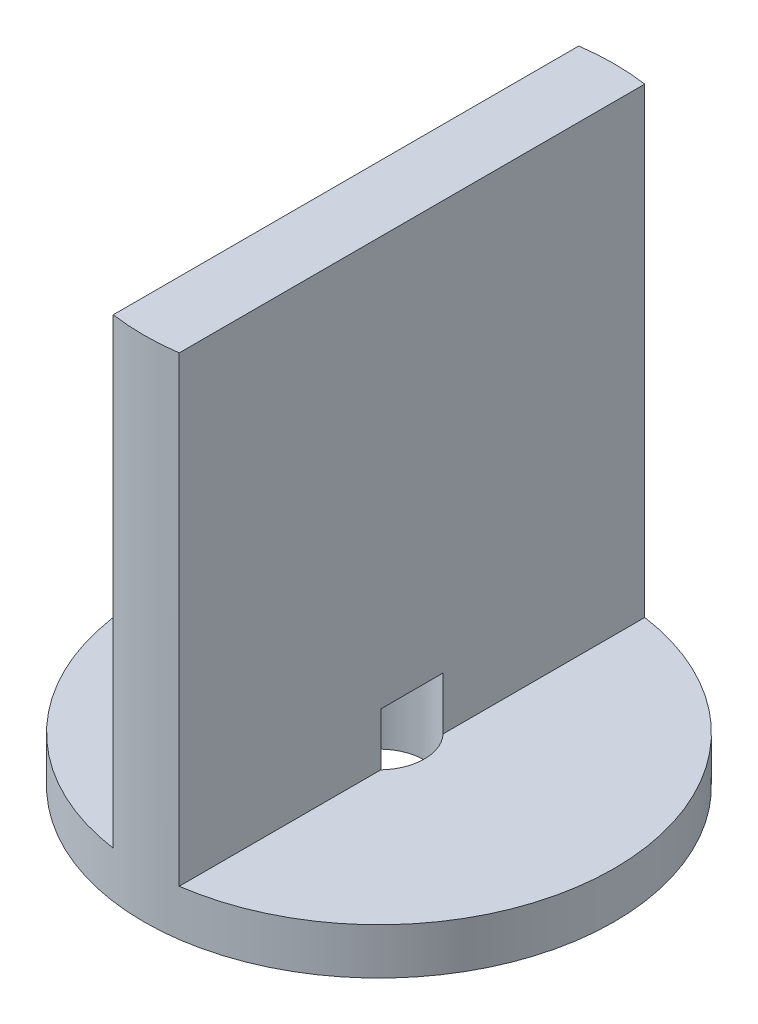
ISO-10303-21;
HEADER;
FILE_DESCRIPTION(('STEP AP214'),'2;1');
FILE_NAME('part.step','',(''),(''),'','','');
FILE_SCHEMA(('AUTOMOTIVE_DESIGN { 1 0 10303 214 1 1 1 1 }'));
ENDSEC;
DATA;
#1=APPLICATION_CONTEXT('core data for automotive mechanical design processes');
#2=APPLICATION_PROTOCOL_DEFINITION('international standard','automotive_design',2000,#1);
#3=PRODUCT_CONTEXT('',#1,'mechanical');
#4=PRODUCT('Part','Part','',(#3));
#5=PRODUCT_RELATED_PRODUCT_CATEGORY('part','',(#4));
#6=PRODUCT_DEFINITION_FORMATION('','',#4);
#7=PRODUCT_DEFINITION_CONTEXT('part definition',#1,'design');
#8=PRODUCT_DEFINITION('design','',#6,#7);
#9=PRODUCT_DEFINITION_SHAPE('','',#8);
#10=(LENGTH_UNIT() NAMED_UNIT(*) SI_UNIT(.MILLI.,.METRE.));
#11=(NAMED_UNIT(*) PLANE_ANGLE_UNIT() SI_UNIT($,.RADIAN.));
#12=(NAMED_UNIT(*) SI_UNIT($,.STERADIAN.) SOLID_ANGLE_UNIT());
#13=UNCERTAINTY_MEASURE_WITH_UNIT(LENGTH_MEASURE(1.E-05),#10,'distance_accuracy_value','');
#14=(GEOMETRIC_REPRESENTATION_CONTEXT(3) GLOBAL_UNCERTAINTY_ASSIGNED_CONTEXT((#13)) GLOBAL_UNIT_ASSIGNED_CONTEXT((#10,
#11,#12)) REPRESENTATION_CONTEXT('',''));
#15=CARTESIAN_POINT('',(0.,0.,0.));
#16=DIRECTION('',(0.,0.,1.));
#17=DIRECTION('',(1.,0.,0.));
#18=AXIS2_PLACEMENT_3D('',#15,#16,#17);
#19=CARTESIAN_POINT('',(0.,7.112,0.));
#20=DIRECTION('',(0.,1.,0.));
#21=DIRECTION('',(0.,0.,1.));
#22=AXIS2_PLACEMENT_3D('',#19,#20,#21);
#23=PLANE('',#22);
#24=CARTESIAN_POINT('',(0.,7.112,0.));
#25=DIRECTION('',(0.,1.,0.));
#26=DIRECTION('',(0.,0.,1.));
#27=AXIS2_PLACEMENT_3D('',#24,#25,#26);
#28=CIRCLE('',#27,36.195);
#29=CARTESIAN_POINT('',(-5.08,7.112,-35.8367356911871));
#30=VERTEX_POINT('',#29);
#31=CARTESIAN_POINT('',(-5.08,7.112,35.8367356911871));
#32=VERTEX_POINT('',#31);
#33=EDGE_CURVE('E67',#30,#32,#28,.T.);
#34=ORIENTED_EDGE('',*,*,#33,.T.);
#35=DIRECTION('',(0.,0.,-1.));
#36=VECTOR('',#35,1.);
#37=CARTESIAN_POINT('',(-5.08,7.112,0.));
#38=LINE('',#37,#36);
#39=CARTESIAN_POINT('',(-5.08,7.112,4.79414486639693));
#40=VERTEX_POINT('',#39);
#41=EDGE_CURVE('E53',#32,#40,#38,.T.);
#42=ORIENTED_EDGE('',*,*,#41,.T.);
#43=CARTESIAN_POINT('',(0.,7.112,0.));
#44=DIRECTION('',(0.,1.,0.));
#45=DIRECTION('',(0.,0.,1.));
#46=AXIS2_PLACEMENT_3D('',#43,#44,#45);
#47=CIRCLE('',#46,6.985);
#48=CARTESIAN_POINT('',(-5.08,7.112,-4.79414486639693));
#49=VERTEX_POINT('',#48);
#50=EDGE_CURVE('E204',#49,#40,#47,.T.);
#51=ORIENTED_EDGE('',*,*,#50,.F.);
#52=EDGE_CURVE('E11',#49,#30,#38,.T.);
#53=ORIENTED_EDGE('',*,*,#52,.T.);
#54=EDGE_LOOP('',(#34,#42,#51,#53));
#55=FACE_BOUND('',#54,.T.);
#56=ADVANCED_FACE('F41',(#55),#23,.T.);
#57=DIRECTION('',(0.,0.,-1.));
#58=VECTOR('',#57,1.);
#59=CARTESIAN_POINT('',(5.08,7.112,0.));
#60=LINE('',#59,#58);
#61=CARTESIAN_POINT('',(5.08,7.112,35.8367356911871));
#62=VERTEX_POINT('',#61);
#63=CARTESIAN_POINT('',(5.08,7.112,4.79414486639692));
#64=VERTEX_POINT('',#63);
#65=EDGE_CURVE('E171',#62,#64,#60,.T.);
#66=ORIENTED_EDGE('',*,*,#65,.F.);
#67=CARTESIAN_POINT('',(5.08,7.112,-35.8367356911871));
#68=VERTEX_POINT('',#67);
#69=EDGE_CURVE('E207',#62,#68,#28,.T.);
#70=ORIENTED_EDGE('',*,*,#69,.T.);
#71=CARTESIAN_POINT('',(5.08,7.112,-4.79414486639693));
#72=VERTEX_POINT('',#71);
#73=EDGE_CURVE('E51',#72,#68,#60,.T.);
#74=ORIENTED_EDGE('',*,*,#73,.F.);
#75=EDGE_CURVE('E200',#64,#72,#47,.T.);
#76=ORIENTED_EDGE('',*,*,#75,.F.);
#77=EDGE_LOOP('',(#66,#70,#74,#76));
#78=FACE_BOUND('',#77,.T.);
#79=ADVANCED_FACE('F223',(#78),#23,.T.);
#80=CARTESIAN_POINT('',(0.,0.,0.));
#81=DIRECTION('',(0.,1.,0.));
#82=DIRECTION('',(0.,0.,1.));
#83=AXIS2_PLACEMENT_3D('',#80,#81,#82);
#84=PLANE('',#83);
#85=CARTESIAN_POINT('',(19.05,0.,0.));
#86=DIRECTION('',(0.,-1.,0.));
#87=DIRECTION('',(0.,0.,-1.));
#88=AXIS2_PLACEMENT_3D('',#85,#86,#87);
#89=CIRCLE('',#88,1.78600099999999);
#90=CARTESIAN_POINT('',(19.05,0.,-1.78600099999999));
#91=VERTEX_POINT('',#90);
#92=EDGE_CURVE('E127',#91,#91,#89,.T.);
#93=ORIENTED_EDGE('',*,*,#92,.F.);
#94=EDGE_LOOP('',(#93));
#95=FACE_BOUND('',#94,.T.);
#96=CARTESIAN_POINT('',(-19.05,0.,0.));
#97=DIRECTION('',(0.,-1.,0.));
#98=DIRECTION('',(0.,0.,-1.));
#99=AXIS2_PLACEMENT_3D('',#96,#97,#98);
#100=CIRCLE('',#99,1.78600099999999);
#101=CARTESIAN_POINT('',(-19.05,0.,-1.78600099999999));
#102=VERTEX_POINT('',#101);
#103=EDGE_CURVE('E126',#102,#102,#100,.T.);
#104=ORIENTED_EDGE('',*,*,#103,.F.);
#105=EDGE_LOOP('',(#104));
#106=FACE_BOUND('',#105,.T.);
#107=CARTESIAN_POINT('',(0.,0.,0.));
#108=DIRECTION('',(0.,1.,0.));
#109=DIRECTION('',(0.,0.,1.));
#110=AXIS2_PLACEMENT_3D('',#107,#108,#109);
#111=CIRCLE('',#110,36.195);
#112=CARTESIAN_POINT('',(0.,0.,36.195));
#113=VERTEX_POINT('',#112);
#114=EDGE_CURVE('E45',#113,#113,#111,.T.);
#115=ORIENTED_EDGE('',*,*,#114,.F.);
#116=EDGE_LOOP('',(#115));
#117=FACE_BOUND('',#116,.T.);
#118=CARTESIAN_POINT('',(0.,0.,0.));
#119=DIRECTION('',(0.,1.,0.));
#120=DIRECTION('',(0.,0.,1.));
#121=AXIS2_PLACEMENT_3D('',#118,#119,#120);
#122=CIRCLE('',#121,6.985);
#123=CARTESIAN_POINT('',(0.,0.,6.985));
#124=VERTEX_POINT('',#123);
#125=EDGE_CURVE('E199',#124,#124,#122,.T.);
#126=ORIENTED_EDGE('',*,*,#125,.T.);
#127=EDGE_LOOP('',(#126));
#128=FACE_BOUND('',#127,.T.);
#129=ADVANCED_FACE('F220',(#95,#106,#117,#128),#84,.F.);
#130=CARTESIAN_POINT('',(0.,7.112,0.));
#131=DIRECTION('',(0.,-1.,0.));
#132=DIRECTION('',(0.,0.,-1.));
#133=AXIS2_PLACEMENT_3D('',#130,#131,#132);
#134=CYLINDRICAL_SURFACE('',#133,36.195);
#135=ORIENTED_EDGE('',*,*,#69,.F.);
#136=DIRECTION('',(0.,-1.,0.));
#137=VECTOR('',#136,1.);
#138=CARTESIAN_POINT('',(5.08,78.232,35.8367356911871));
#139=LINE('',#138,#137);
#140=CARTESIAN_POINT('',(5.08,78.232,35.8367356911871));
#141=VERTEX_POINT('',#140);
#142=EDGE_CURVE('E192',#141,#62,#139,.T.);
#143=ORIENTED_EDGE('',*,*,#142,.F.);
#144=CARTESIAN_POINT('',(0.,78.232,0.));
#145=DIRECTION('',(0.,1.,0.));
#146=DIRECTION('',(0.,0.,1.));
#147=AXIS2_PLACEMENT_3D('',#144,#145,#146);
#148=CIRCLE('',#147,36.195);
#149=CARTESIAN_POINT('',(-5.08,78.232,35.8367356911871));
#150=VERTEX_POINT('',#149);
#151=EDGE_CURVE('E170',#150,#141,#148,.T.);
#152=ORIENTED_EDGE('',*,*,#151,.F.);
#153=DIRECTION('',(0.,-1.,0.));
#154=VECTOR('',#153,1.);
#155=CARTESIAN_POINT('',(-5.08,78.232,35.8367356911871));
#156=LINE('',#155,#154);
#157=EDGE_CURVE('E196',#150,#32,#156,.T.);
#158=ORIENTED_EDGE('',*,*,#157,.T.);
#159=ORIENTED_EDGE('',*,*,#33,.F.);
#160=DIRECTION('',(0.,-1.,0.));
#161=VECTOR('',#160,1.);
#162=CARTESIAN_POINT('',(-5.08,78.232,-35.8367356911871));
#163=LINE('',#162,#161);
#164=CARTESIAN_POINT('',(-5.08,78.232,-35.8367356911871));
#165=VERTEX_POINT('',#164);
#166=EDGE_CURVE('E179',#165,#30,#163,.T.);
#167=ORIENTED_EDGE('',*,*,#166,.F.);
#168=CARTESIAN_POINT('',(0.,78.232,0.));
#169=DIRECTION('',(0.,1.,0.));
#170=DIRECTION('',(0.,0.,1.));
#171=AXIS2_PLACEMENT_3D('',#168,#169,#170);
#172=CIRCLE('',#171,36.195);
#173=CARTESIAN_POINT('',(5.08,78.232,-35.8367356911871));
#174=VERTEX_POINT('',#173);
#175=EDGE_CURVE('E177',#174,#165,#172,.T.);
#176=ORIENTED_EDGE('',*,*,#175,.F.);
#177=DIRECTION('',(0.,-1.,0.));
#178=VECTOR('',#177,1.);
#179=CARTESIAN_POINT('',(5.08,78.232,-35.8367356911871));
#180=LINE('',#179,#178);
#181=EDGE_CURVE('E188',#174,#68,#180,.T.);
#182=ORIENTED_EDGE('',*,*,#181,.T.);
#183=EDGE_LOOP('',(#135,#143,#152,#158,#159,#167,#176,#182));
#184=FACE_BOUND('',#183,.T.);
#185=ORIENTED_EDGE('',*,*,#114,.T.);
#186=EDGE_LOOP('',(#185));
#187=FACE_BOUND('',#186,.T.);
#188=ADVANCED_FACE('F43',(#184,#187),#134,.T.);
#189=CARTESIAN_POINT('',(0.,7.112,0.));
#190=DIRECTION('',(0.,-1.,0.));
#191=DIRECTION('',(0.,0.,-1.));
#192=AXIS2_PLACEMENT_3D('',#189,#190,#191);
#193=CYLINDRICAL_SURFACE('',#192,6.985);
#194=ORIENTED_EDGE('',*,*,#75,.T.);
#195=DIRECTION('',(0.,-1.,0.));
#196=VECTOR('',#195,1.);
#197=CARTESIAN_POINT('',(5.08,15.24,-4.79414486639693));
#198=LINE('',#197,#196);
#199=CARTESIAN_POINT('',(5.08,15.24,-4.79414486639693));
#200=VERTEX_POINT('',#199);
#201=EDGE_CURVE('E161',#200,#72,#198,.T.);
#202=ORIENTED_EDGE('',*,*,#201,.F.);
#203=CARTESIAN_POINT('',(0.,15.24,0.));
#204=DIRECTION('',(0.,-1.,0.));
#205=DIRECTION('',(0.,0.,-1.));
#206=AXIS2_PLACEMENT_3D('',#203,#204,#205);
#207=CIRCLE('',#206,6.985);
#208=CARTESIAN_POINT('',(-5.08,15.24,-4.79414486639693));
#209=VERTEX_POINT('',#208);
#210=EDGE_CURVE('E144',#209,#200,#207,.T.);
#211=ORIENTED_EDGE('',*,*,#210,.F.);
#212=DIRECTION('',(0.,-1.,0.));
#213=VECTOR('',#212,1.);
#214=CARTESIAN_POINT('',(-5.08,15.24,-4.79414486639693));
#215=LINE('',#214,#213);
#216=EDGE_CURVE('E60',#209,#49,#215,.T.);
#217=ORIENTED_EDGE('',*,*,#216,.T.);
#218=ORIENTED_EDGE('',*,*,#50,.T.);
#219=DIRECTION('',(0.,-1.,0.));
#220=VECTOR('',#219,1.);
#221=CARTESIAN_POINT('',(-5.08,15.24,4.79414486639693));
#222=LINE('',#221,#220);
#223=CARTESIAN_POINT('',(-5.08,15.24,4.79414486639693));
#224=VERTEX_POINT('',#223);
#225=EDGE_CURVE('E155',#224,#40,#222,.T.);
#226=ORIENTED_EDGE('',*,*,#225,.F.);
#227=CARTESIAN_POINT('',(0.,15.24,0.));
#228=DIRECTION('',(0.,-1.,0.));
#229=DIRECTION('',(0.,0.,-1.));
#230=AXIS2_PLACEMENT_3D('',#227,#228,#229);
#231=CIRCLE('',#230,6.985);
#232=CARTESIAN_POINT('',(5.08,15.24,4.79414486639692));
#233=VERTEX_POINT('',#232);
#234=EDGE_CURVE('E151',#233,#224,#231,.T.);
#235=ORIENTED_EDGE('',*,*,#234,.F.);
#236=DIRECTION('',(0.,-1.,0.));
#237=VECTOR('',#236,1.);
#238=CARTESIAN_POINT('',(5.08,15.24,4.79414486639692));
#239=LINE('',#238,#237);
#240=EDGE_CURVE('E158',#233,#64,#239,.T.);
#241=ORIENTED_EDGE('',*,*,#240,.T.);
#242=EDGE_LOOP('',(#194,#202,#211,#217,#218,#226,#235,#241));
#243=FACE_BOUND('',#242,.T.);
#244=ORIENTED_EDGE('',*,*,#125,.F.);
#245=EDGE_LOOP('',(#244));
#246=FACE_BOUND('',#245,.T.);
#247=ADVANCED_FACE('F227',(#243,#246),#193,.F.);
#248=CARTESIAN_POINT('',(-5.08,78.232,0.));
#249=DIRECTION('',(-1.,0.,0.));
#250=DIRECTION('',(0.,0.,1.));
#251=AXIS2_PLACEMENT_3D('',#248,#249,#250);
#252=PLANE('',#251);
#253=ORIENTED_EDGE('',*,*,#225,.T.);
#254=ORIENTED_EDGE('',*,*,#41,.F.);
#255=ORIENTED_EDGE('',*,*,#157,.F.);
#256=DIRECTION('',(0.,0.,-1.));
#257=VECTOR('',#256,1.);
#258=CARTESIAN_POINT('',(-5.08,78.232,0.));
#259=LINE('',#258,#257);
#260=EDGE_CURVE('E166',#150,#165,#259,.T.);
#261=ORIENTED_EDGE('',*,*,#260,.T.);
#262=ORIENTED_EDGE('',*,*,#166,.T.);
#263=ORIENTED_EDGE('',*,*,#52,.F.);
#264=ORIENTED_EDGE('',*,*,#216,.F.);
#265=DIRECTION('',(0.,0.,-1.));
#266=VECTOR('',#265,1.);
#267=CARTESIAN_POINT('',(-5.08,15.24,0.));
#268=LINE('',#267,#266);
#269=EDGE_CURVE('E140',#224,#209,#268,.T.);
#270=ORIENTED_EDGE('',*,*,#269,.F.);
#271=EDGE_LOOP('',(#253,#254,#255,#261,#262,#263,#264,#270));
#272=FACE_BOUND('',#271,.T.);
#273=ADVANCED_FACE('F229',(#272),#252,.T.);
#274=CARTESIAN_POINT('',(5.08,78.232,0.));
#275=DIRECTION('',(-1.,0.,0.));
#276=DIRECTION('',(0.,0.,1.));
#277=AXIS2_PLACEMENT_3D('',#274,#275,#276);
#278=PLANE('',#277);
#279=ORIENTED_EDGE('',*,*,#65,.T.);
#280=ORIENTED_EDGE('',*,*,#240,.F.);
#281=DIRECTION('',(0.,0.,1.));
#282=VECTOR('',#281,1.);
#283=CARTESIAN_POINT('',(5.08,15.24,0.));
#284=LINE('',#283,#282);
#285=EDGE_CURVE('E148',#200,#233,#284,.T.);
#286=ORIENTED_EDGE('',*,*,#285,.F.);
#287=ORIENTED_EDGE('',*,*,#201,.T.);
#288=ORIENTED_EDGE('',*,*,#73,.T.);
#289=ORIENTED_EDGE('',*,*,#181,.F.);
#290=DIRECTION('',(0.,0.,-1.));
#291=VECTOR('',#290,1.);
#292=CARTESIAN_POINT('',(5.08,78.232,0.));
#293=LINE('',#292,#291);
#294=EDGE_CURVE('E174',#141,#174,#293,.T.);
#295=ORIENTED_EDGE('',*,*,#294,.F.);
#296=ORIENTED_EDGE('',*,*,#142,.T.);
#297=EDGE_LOOP('',(#279,#280,#286,#287,#288,#289,#295,#296));
#298=FACE_BOUND('',#297,.T.);
#299=ADVANCED_FACE('F235',(#298),#278,.F.);
#300=CARTESIAN_POINT('',(0.,78.232,0.));
#301=DIRECTION('',(0.,1.,0.));
#302=DIRECTION('',(0.,0.,1.));
#303=AXIS2_PLACEMENT_3D('',#300,#301,#302);
#304=PLANE('',#303);
#305=ORIENTED_EDGE('',*,*,#260,.F.);
#306=ORIENTED_EDGE('',*,*,#151,.T.);
#307=ORIENTED_EDGE('',*,*,#294,.T.);
#308=ORIENTED_EDGE('',*,*,#175,.T.);
#309=EDGE_LOOP('',(#305,#306,#307,#308));
#310=FACE_BOUND('',#309,.T.);
#311=ADVANCED_FACE('F256',(#310),#304,.T.);
#312=CARTESIAN_POINT('',(0.,15.24,0.));
#313=DIRECTION('',(0.,-1.,0.));
#314=DIRECTION('',(0.,0.,-1.));
#315=AXIS2_PLACEMENT_3D('',#312,#313,#314);
#316=PLANE('',#315);
#317=ORIENTED_EDGE('',*,*,#269,.T.);
#318=ORIENTED_EDGE('',*,*,#210,.T.);
#319=ORIENTED_EDGE('',*,*,#285,.T.);
#320=ORIENTED_EDGE('',*,*,#234,.T.);
#321=EDGE_LOOP('',(#317,#318,#319,#320));
#322=FACE_BOUND('',#321,.T.);
#323=ADVANCED_FACE('F264',(#322),#316,.T.);
#324=CARTESIAN_POINT('',(-19.05,5.588,0.));
#325=DIRECTION('',(0.,-1.,0.));
#326=DIRECTION('',(0.,0.,-1.));
#327=AXIS2_PLACEMENT_3D('',#324,#325,#326);
#328=CONICAL_SURFACE('',#327,1.78600099999999,1.02974425867665);
#329=CARTESIAN_POINT('',(-19.05,6.66113766644384,0.));
#330=VERTEX_POINT('',#329);
#331=VERTEX_LOOP('',#330);
#332=FACE_BOUND('',#331,.T.);
#333=CARTESIAN_POINT('',(-19.05,5.588,0.));
#334=DIRECTION('',(0.,-1.,0.));
#335=DIRECTION('',(0.,0.,-1.));
#336=AXIS2_PLACEMENT_3D('',#333,#334,#335);
#337=CIRCLE('',#336,1.78600099999999);
#338=CARTESIAN_POINT('',(-19.05,5.588,-1.78600099999999));
#339=VERTEX_POINT('',#338);
#340=EDGE_CURVE('E132',#339,#339,#337,.T.);
#341=ORIENTED_EDGE('',*,*,#340,.T.);
#342=EDGE_LOOP('',(#341));
#343=FACE_BOUND('',#342,.T.);
#344=ADVANCED_FACE('F267',(#332,#343),#328,.F.);
#345=CARTESIAN_POINT('',(-19.05,0.,0.));
#346=DIRECTION('',(0.,-1.,0.));
#347=DIRECTION('',(0.,0.,-1.));
#348=AXIS2_PLACEMENT_3D('',#345,#346,#347);
#349=CYLINDRICAL_SURFACE('',#348,1.78600099999999);
#350=ORIENTED_EDGE('',*,*,#340,.F.);
#351=EDGE_LOOP('',(#350));
#352=FACE_BOUND('',#351,.T.);
#353=ORIENTED_EDGE('',*,*,#103,.T.);
#354=EDGE_LOOP('',(#353));
#355=FACE_BOUND('',#354,.T.);
#356=ADVANCED_FACE('F119',(#352,#355),#349,.F.);
#357=CARTESIAN_POINT('',(19.05,5.588,0.));
#358=DIRECTION('',(0.,-1.,0.));
#359=DIRECTION('',(0.,0.,-1.));
#360=AXIS2_PLACEMENT_3D('',#357,#358,#359);
#361=CONICAL_SURFACE('',#360,1.78600099999999,1.02974425867665);
#362=CARTESIAN_POINT('',(19.05,6.66113766644384,0.));
#363=VERTEX_POINT('',#362);
#364=VERTEX_LOOP('',#363);
#365=FACE_BOUND('',#364,.T.);
#366=CARTESIAN_POINT('',(19.05,5.588,0.));
#367=DIRECTION('',(0.,-1.,0.));
#368=DIRECTION('',(0.,0.,-1.));
#369=AXIS2_PLACEMENT_3D('',#366,#367,#368);
#370=CIRCLE('',#369,1.78600099999999);
#371=CARTESIAN_POINT('',(19.05,5.588,-1.78600099999999));
#372=VERTEX_POINT('',#371);
#373=EDGE_CURVE('E123',#372,#372,#370,.T.);
#374=ORIENTED_EDGE('',*,*,#373,.T.);
#375=EDGE_LOOP('',(#374));
#376=FACE_BOUND('',#375,.T.);
#377=ADVANCED_FACE('F115',(#365,#376),#361,.F.);
#378=CARTESIAN_POINT('',(19.05,0.,0.));
#379=DIRECTION('',(0.,-1.,0.));
#380=DIRECTION('',(0.,0.,-1.));
#381=AXIS2_PLACEMENT_3D('',#378,#379,#380);
#382=CYLINDRICAL_SURFACE('',#381,1.78600099999999);
#383=ORIENTED_EDGE('',*,*,#373,.F.);
#384=EDGE_LOOP('',(#383));
#385=FACE_BOUND('',#384,.T.);
#386=ORIENTED_EDGE('',*,*,#92,.T.);
#387=EDGE_LOOP('',(#386));
#388=FACE_BOUND('',#387,.T.);
#389=ADVANCED_FACE('F118',(#385,#388),#382,.F.);
#390=CLOSED_SHELL('',(#56,#79,#129,#188,#247,#273,#299,#311,#323,#344,#356,#377,#389));
#391=MANIFOLD_SOLID_BREP('B2',#390);
#392=ADVANCED_BREP_SHAPE_REPRESENTATION('',(#18,#391),#14);
#393=SHAPE_DEFINITION_REPRESENTATION(#9,#392);
ENDSEC;
END-ISO-10303-21;
